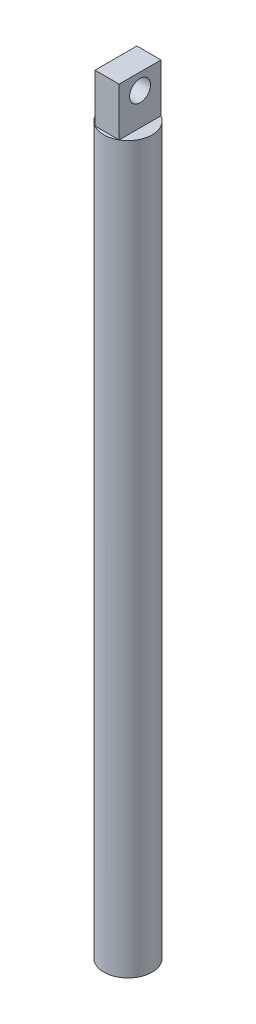
ISO-10303-21;
HEADER;
FILE_DESCRIPTION(('STEP AP214'),'2;1');
FILE_NAME('part.step','',(''),(''),'','','');
FILE_SCHEMA(('AUTOMOTIVE_DESIGN { 1 0 10303 214 1 1 1 1 }'));
ENDSEC;
DATA;
#1=APPLICATION_CONTEXT('core data for automotive mechanical design processes');
#2=APPLICATION_PROTOCOL_DEFINITION('international standard','automotive_design',2000,#1);
#3=PRODUCT_CONTEXT('',#1,'mechanical');
#4=PRODUCT('Part','Part','',(#3));
#5=PRODUCT_RELATED_PRODUCT_CATEGORY('part','',(#4));
#6=PRODUCT_DEFINITION_FORMATION('','',#4);
#7=PRODUCT_DEFINITION_CONTEXT('part definition',#1,'design');
#8=PRODUCT_DEFINITION('design','',#6,#7);
#9=PRODUCT_DEFINITION_SHAPE('','',#8);
#10=(LENGTH_UNIT() NAMED_UNIT(*) SI_UNIT(.MILLI.,.METRE.));
#11=(NAMED_UNIT(*) PLANE_ANGLE_UNIT() SI_UNIT($,.RADIAN.));
#12=(NAMED_UNIT(*) SI_UNIT($,.STERADIAN.) SOLID_ANGLE_UNIT());
#13=UNCERTAINTY_MEASURE_WITH_UNIT(LENGTH_MEASURE(1.E-05),#10,'distance_accuracy_value','');
#14=(GEOMETRIC_REPRESENTATION_CONTEXT(3) GLOBAL_UNCERTAINTY_ASSIGNED_CONTEXT((#13)) GLOBAL_UNIT_ASSIGNED_CONTEXT((#10,
#11,#12)) REPRESENTATION_CONTEXT('',''));
#15=CARTESIAN_POINT('',(0.,0.,0.));
#16=DIRECTION('',(0.,0.,1.));
#17=DIRECTION('',(1.,0.,0.));
#18=AXIS2_PLACEMENT_3D('',#15,#16,#17);
#19=CARTESIAN_POINT('',(0.,0.,0.));
#20=DIRECTION('',(0.,1.,0.));
#21=DIRECTION('',(1.,0.,0.));
#22=AXIS2_PLACEMENT_3D('',#19,#20,#21);
#23=PLANE('',#22);
#24=CARTESIAN_POINT('',(0.,0.,0.));
#25=DIRECTION('',(0.,1.,0.));
#26=DIRECTION('',(-1.,0.,0.));
#27=AXIS2_PLACEMENT_3D('',#24,#25,#26);
#28=CIRCLE('',#27,15.);
#29=CARTESIAN_POINT('',(15.,0.,0.));
#30=VERTEX_POINT('',#29);
#31=EDGE_CURVE('E10',#30,#30,#28,.T.);
#32=ORIENTED_EDGE('',*,*,#31,.F.);
#33=EDGE_LOOP('',(#32));
#34=FACE_BOUND('',#33,.T.);
#35=ADVANCED_FACE('F16',(#34),#23,.F.);
#36=CARTESIAN_POINT('',(0.,0.,0.));
#37=DIRECTION('',(0.,1.,0.));
#38=DIRECTION('',(-1.,0.,0.));
#39=AXIS2_PLACEMENT_3D('',#36,#37,#38);
#40=CYLINDRICAL_SURFACE('',#39,15.);
#41=CARTESIAN_POINT('',(0.,450.,0.));
#42=DIRECTION('',(0.,1.,0.));
#43=DIRECTION('',(-1.,0.,0.));
#44=AXIS2_PLACEMENT_3D('',#41,#42,#43);
#45=CIRCLE('',#44,15.);
#46=CARTESIAN_POINT('',(-7.48331477354788,450.,-13.));
#47=VERTEX_POINT('',#46);
#48=CARTESIAN_POINT('',(-7.48331477354788,450.,13.));
#49=VERTEX_POINT('',#48);
#50=EDGE_CURVE('E55',#47,#49,#45,.T.);
#51=ORIENTED_EDGE('',*,*,#50,.F.);
#52=CARTESIAN_POINT('',(0.,450.,0.));
#53=DIRECTION('',(0.,1.,0.));
#54=DIRECTION('',(-1.,0.,0.));
#55=AXIS2_PLACEMENT_3D('',#52,#53,#54);
#56=CIRCLE('',#55,15.);
#57=CARTESIAN_POINT('',(7.48331477354788,450.,-13.));
#58=VERTEX_POINT('',#57);
#59=EDGE_CURVE('E90',#58,#47,#56,.T.);
#60=ORIENTED_EDGE('',*,*,#59,.F.);
#61=CARTESIAN_POINT('',(0.,450.,0.));
#62=DIRECTION('',(0.,1.,0.));
#63=DIRECTION('',(-1.,0.,0.));
#64=AXIS2_PLACEMENT_3D('',#61,#62,#63);
#65=CIRCLE('',#64,15.);
#66=CARTESIAN_POINT('',(15.,450.,0.));
#67=VERTEX_POINT('',#66);
#68=EDGE_CURVE('E131',#67,#58,#65,.T.);
#69=ORIENTED_EDGE('',*,*,#68,.F.);
#70=DIRECTION('',(0.,-1.,0.));
#71=VECTOR('',#70,1.);
#72=CARTESIAN_POINT('',(15.,0.,0.));
#73=LINE('',#72,#71);
#74=EDGE_CURVE('E27',#67,#30,#73,.T.);
#75=ORIENTED_EDGE('',*,*,#74,.T.);
#76=ORIENTED_EDGE('',*,*,#31,.T.);
#77=ORIENTED_EDGE('',*,*,#74,.F.);
#78=CARTESIAN_POINT('',(0.,450.,0.));
#79=DIRECTION('',(0.,1.,0.));
#80=DIRECTION('',(-1.,0.,0.));
#81=AXIS2_PLACEMENT_3D('',#78,#79,#80);
#82=CIRCLE('',#81,15.);
#83=CARTESIAN_POINT('',(7.48331477354788,450.,13.));
#84=VERTEX_POINT('',#83);
#85=EDGE_CURVE('E127',#84,#67,#82,.T.);
#86=ORIENTED_EDGE('',*,*,#85,.F.);
#87=CARTESIAN_POINT('',(0.,450.,0.));
#88=DIRECTION('',(0.,1.,0.));
#89=DIRECTION('',(-1.,0.,0.));
#90=AXIS2_PLACEMENT_3D('',#87,#88,#89);
#91=CIRCLE('',#90,15.);
#92=EDGE_CURVE('E126',#49,#84,#91,.T.);
#93=ORIENTED_EDGE('',*,*,#92,.F.);
#94=EDGE_LOOP('',(#51,#60,#69,#75,#76,#77,#86,#93));
#95=FACE_BOUND('',#94,.T.);
#96=ADVANCED_FACE('F184',(#95),#40,.T.);
#97=CARTESIAN_POINT('',(0.,450.,0.));
#98=DIRECTION('',(0.,1.,0.));
#99=DIRECTION('',(1.,0.,0.));
#100=AXIS2_PLACEMENT_3D('',#97,#98,#99);
#101=PLANE('',#100);
#102=DIRECTION('',(1.,0.,0.));
#103=VECTOR('',#102,1.);
#104=CARTESIAN_POINT('',(3.74165738677394,450.,-13.));
#105=LINE('',#104,#103);
#106=EDGE_CURVE('E153',#47,#58,#105,.T.);
#107=ORIENTED_EDGE('',*,*,#106,.T.);
#108=ORIENTED_EDGE('',*,*,#59,.T.);
#109=EDGE_LOOP('',(#107,#108));
#110=FACE_BOUND('',#109,.T.);
#111=ADVANCED_FACE('F202',(#110),#101,.T.);
#112=CARTESIAN_POINT('',(0.,450.,0.));
#113=DIRECTION('',(0.,1.,0.));
#114=DIRECTION('',(1.,0.,0.));
#115=AXIS2_PLACEMENT_3D('',#112,#113,#114);
#116=PLANE('',#115);
#117=DIRECTION('',(0.,0.,-1.));
#118=VECTOR('',#117,1.);
#119=CARTESIAN_POINT('',(-7.48331477354788,450.,-6.5));
#120=LINE('',#119,#118);
#121=EDGE_CURVE('E139',#49,#47,#120,.T.);
#122=ORIENTED_EDGE('',*,*,#121,.T.);
#123=ORIENTED_EDGE('',*,*,#50,.T.);
#124=EDGE_LOOP('',(#122,#123));
#125=FACE_BOUND('',#124,.T.);
#126=ADVANCED_FACE('F229',(#125),#116,.T.);
#127=CARTESIAN_POINT('',(0.,450.,0.));
#128=DIRECTION('',(0.,1.,0.));
#129=DIRECTION('',(1.,0.,0.));
#130=AXIS2_PLACEMENT_3D('',#127,#128,#129);
#131=PLANE('',#130);
#132=DIRECTION('',(-1.,0.,0.));
#133=VECTOR('',#132,1.);
#134=CARTESIAN_POINT('',(-3.74165738677394,450.,13.));
#135=LINE('',#134,#133);
#136=EDGE_CURVE('E136',#84,#49,#135,.T.);
#137=ORIENTED_EDGE('',*,*,#136,.T.);
#138=ORIENTED_EDGE('',*,*,#92,.T.);
#139=EDGE_LOOP('',(#137,#138));
#140=FACE_BOUND('',#139,.T.);
#141=ADVANCED_FACE('F182',(#140),#131,.T.);
#142=CARTESIAN_POINT('',(0.,450.,0.));
#143=DIRECTION('',(0.,1.,0.));
#144=DIRECTION('',(1.,0.,0.));
#145=AXIS2_PLACEMENT_3D('',#142,#143,#144);
#146=PLANE('',#145);
#147=DIRECTION('',(0.,0.,1.));
#148=VECTOR('',#147,1.);
#149=CARTESIAN_POINT('',(7.48331477354788,450.,6.5));
#150=LINE('',#149,#148);
#151=EDGE_CURVE('E102',#58,#84,#150,.T.);
#152=ORIENTED_EDGE('',*,*,#151,.T.);
#153=ORIENTED_EDGE('',*,*,#85,.T.);
#154=ORIENTED_EDGE('',*,*,#68,.T.);
#155=EDGE_LOOP('',(#152,#153,#154));
#156=FACE_BOUND('',#155,.T.);
#157=ADVANCED_FACE('F194',(#156),#146,.T.);
#158=CARTESIAN_POINT('',(0.,480.,0.));
#159=DIRECTION('',(0.,1.,0.));
#160=DIRECTION('',(1.,0.,0.));
#161=AXIS2_PLACEMENT_3D('',#158,#159,#160);
#162=PLANE('',#161);
#163=DIRECTION('',(-1.,0.,0.));
#164=VECTOR('',#163,1.);
#165=CARTESIAN_POINT('',(7.48331477354788,480.,-13.));
#166=LINE('',#165,#164);
#167=CARTESIAN_POINT('',(7.48331477354788,480.,-13.));
#168=VERTEX_POINT('',#167);
#169=CARTESIAN_POINT('',(-7.48331477354788,480.,-13.));
#170=VERTEX_POINT('',#169);
#171=EDGE_CURVE('E132',#168,#170,#166,.T.);
#172=ORIENTED_EDGE('',*,*,#171,.T.);
#173=DIRECTION('',(0.,0.,1.));
#174=VECTOR('',#173,1.);
#175=CARTESIAN_POINT('',(-7.48331477354788,480.,-13.));
#176=LINE('',#175,#174);
#177=CARTESIAN_POINT('',(-7.48331477354788,480.,13.));
#178=VERTEX_POINT('',#177);
#179=EDGE_CURVE('E141',#170,#178,#176,.T.);
#180=ORIENTED_EDGE('',*,*,#179,.T.);
#181=DIRECTION('',(1.,0.,0.));
#182=VECTOR('',#181,1.);
#183=CARTESIAN_POINT('',(-7.48331477354788,480.,13.));
#184=LINE('',#183,#182);
#185=CARTESIAN_POINT('',(7.48331477354788,480.,13.));
#186=VERTEX_POINT('',#185);
#187=EDGE_CURVE('E70',#178,#186,#184,.T.);
#188=ORIENTED_EDGE('',*,*,#187,.T.);
#189=DIRECTION('',(0.,0.,-1.));
#190=VECTOR('',#189,1.);
#191=CARTESIAN_POINT('',(7.48331477354788,480.,13.));
#192=LINE('',#191,#190);
#193=EDGE_CURVE('E121',#186,#168,#192,.T.);
#194=ORIENTED_EDGE('',*,*,#193,.T.);
#195=EDGE_LOOP('',(#172,#180,#188,#194));
#196=FACE_BOUND('',#195,.T.);
#197=ADVANCED_FACE('F217',(#196),#162,.T.);
#198=CARTESIAN_POINT('',(7.48331477354788,450.,-13.));
#199=DIRECTION('',(0.,0.,-1.));
#200=DIRECTION('',(0.,-1.,0.));
#201=AXIS2_PLACEMENT_3D('',#198,#199,#200);
#202=PLANE('',#201);
#203=ORIENTED_EDGE('',*,*,#106,.F.);
#204=DIRECTION('',(0.,1.,0.));
#205=VECTOR('',#204,1.);
#206=CARTESIAN_POINT('',(-7.48331477354788,450.,-13.));
#207=LINE('',#206,#205);
#208=EDGE_CURVE('E146',#47,#170,#207,.T.);
#209=ORIENTED_EDGE('',*,*,#208,.T.);
#210=ORIENTED_EDGE('',*,*,#171,.F.);
#211=DIRECTION('',(0.,1.,0.));
#212=VECTOR('',#211,1.);
#213=CARTESIAN_POINT('',(7.48331477354788,450.,-13.));
#214=LINE('',#213,#212);
#215=EDGE_CURVE('E110',#58,#168,#214,.T.);
#216=ORIENTED_EDGE('',*,*,#215,.F.);
#217=EDGE_LOOP('',(#203,#209,#210,#216));
#218=FACE_BOUND('',#217,.T.);
#219=ADVANCED_FACE('F18',(#218),#202,.T.);
#220=CARTESIAN_POINT('',(-7.48331477354788,450.,-13.));
#221=DIRECTION('',(-1.,0.,0.));
#222=DIRECTION('',(0.,0.,1.));
#223=AXIS2_PLACEMENT_3D('',#220,#221,#222);
#224=PLANE('',#223);
#225=CARTESIAN_POINT('',(-7.48331477354788,470.,0.));
#226=DIRECTION('',(1.,0.,0.));
#227=DIRECTION('',(0.,0.,1.));
#228=AXIS2_PLACEMENT_3D('',#225,#226,#227);
#229=CIRCLE('',#228,6.5);
#230=CARTESIAN_POINT('',(-7.48331477354788,470.,-6.5));
#231=VERTEX_POINT('',#230);
#232=EDGE_CURVE('E112',#231,#231,#229,.T.);
#233=ORIENTED_EDGE('',*,*,#232,.T.);
#234=EDGE_LOOP('',(#233));
#235=FACE_BOUND('',#234,.T.);
#236=ORIENTED_EDGE('',*,*,#121,.F.);
#237=DIRECTION('',(0.,1.,0.));
#238=VECTOR('',#237,1.);
#239=CARTESIAN_POINT('',(-7.48331477354788,450.,13.));
#240=LINE('',#239,#238);
#241=EDGE_CURVE('E135',#49,#178,#240,.T.);
#242=ORIENTED_EDGE('',*,*,#241,.T.);
#243=ORIENTED_EDGE('',*,*,#179,.F.);
#244=ORIENTED_EDGE('',*,*,#208,.F.);
#245=EDGE_LOOP('',(#236,#242,#243,#244));
#246=FACE_BOUND('',#245,.T.);
#247=ADVANCED_FACE('F206',(#235,#246),#224,.T.);
#248=CARTESIAN_POINT('',(-7.48331477354788,450.,13.));
#249=DIRECTION('',(0.,0.,1.));
#250=DIRECTION('',(1.,0.,0.));
#251=AXIS2_PLACEMENT_3D('',#248,#249,#250);
#252=PLANE('',#251);
#253=ORIENTED_EDGE('',*,*,#136,.F.);
#254=DIRECTION('',(0.,1.,0.));
#255=VECTOR('',#254,1.);
#256=CARTESIAN_POINT('',(7.48331477354788,450.,13.));
#257=LINE('',#256,#255);
#258=EDGE_CURVE('E172',#84,#186,#257,.T.);
#259=ORIENTED_EDGE('',*,*,#258,.T.);
#260=ORIENTED_EDGE('',*,*,#187,.F.);
#261=ORIENTED_EDGE('',*,*,#241,.F.);
#262=EDGE_LOOP('',(#253,#259,#260,#261));
#263=FACE_BOUND('',#262,.T.);
#264=ADVANCED_FACE('F189',(#263),#252,.T.);
#265=CARTESIAN_POINT('',(7.48331477354788,450.,13.));
#266=DIRECTION('',(1.,0.,0.));
#267=DIRECTION('',(0.,1.,0.));
#268=AXIS2_PLACEMENT_3D('',#265,#266,#267);
#269=PLANE('',#268);
#270=CARTESIAN_POINT('',(7.48331477354788,470.,0.));
#271=DIRECTION('',(-1.,0.,0.));
#272=DIRECTION('',(0.,0.,1.));
#273=AXIS2_PLACEMENT_3D('',#270,#271,#272);
#274=CIRCLE('',#273,6.5);
#275=CARTESIAN_POINT('',(7.48331477354788,470.,-6.5));
#276=VERTEX_POINT('',#275);
#277=EDGE_CURVE('E20',#276,#276,#274,.T.);
#278=ORIENTED_EDGE('',*,*,#277,.T.);
#279=EDGE_LOOP('',(#278));
#280=FACE_BOUND('',#279,.T.);
#281=ORIENTED_EDGE('',*,*,#151,.F.);
#282=ORIENTED_EDGE('',*,*,#215,.T.);
#283=ORIENTED_EDGE('',*,*,#193,.F.);
#284=ORIENTED_EDGE('',*,*,#258,.F.);
#285=EDGE_LOOP('',(#281,#282,#283,#284));
#286=FACE_BOUND('',#285,.T.);
#287=ADVANCED_FACE('F97',(#280,#286),#269,.T.);
#288=CARTESIAN_POINT('',(-7.48331477354788,470.,0.));
#289=DIRECTION('',(1.,0.,0.));
#290=DIRECTION('',(0.,0.,1.));
#291=AXIS2_PLACEMENT_3D('',#288,#289,#290);
#292=CYLINDRICAL_SURFACE('',#291,6.5);
#293=ORIENTED_EDGE('',*,*,#232,.F.);
#294=DIRECTION('',(1.,0.,0.));
#295=VECTOR('',#294,1.);
#296=CARTESIAN_POINT('',(-7.48331477354788,470.,-6.5));
#297=LINE('',#296,#295);
#298=EDGE_CURVE('E103',#231,#276,#297,.T.);
#299=ORIENTED_EDGE('',*,*,#298,.T.);
#300=ORIENTED_EDGE('',*,*,#277,.F.);
#301=ORIENTED_EDGE('',*,*,#298,.F.);
#302=EDGE_LOOP('',(#293,#299,#300,#301));
#303=FACE_BOUND('',#302,.T.);
#304=ADVANCED_FACE('F231',(#303),#292,.F.);
#305=CLOSED_SHELL('',(#35,#96,#111,#126,#141,#157,#197,#219,#247,#264,#287,#304));
#306=MANIFOLD_SOLID_BREP('B1',#305);
#307=ADVANCED_BREP_SHAPE_REPRESENTATION('',(#18,#306),#14);
#308=SHAPE_DEFINITION_REPRESENTATION(#9,#307);
ENDSEC;
END-ISO-10303-21;
